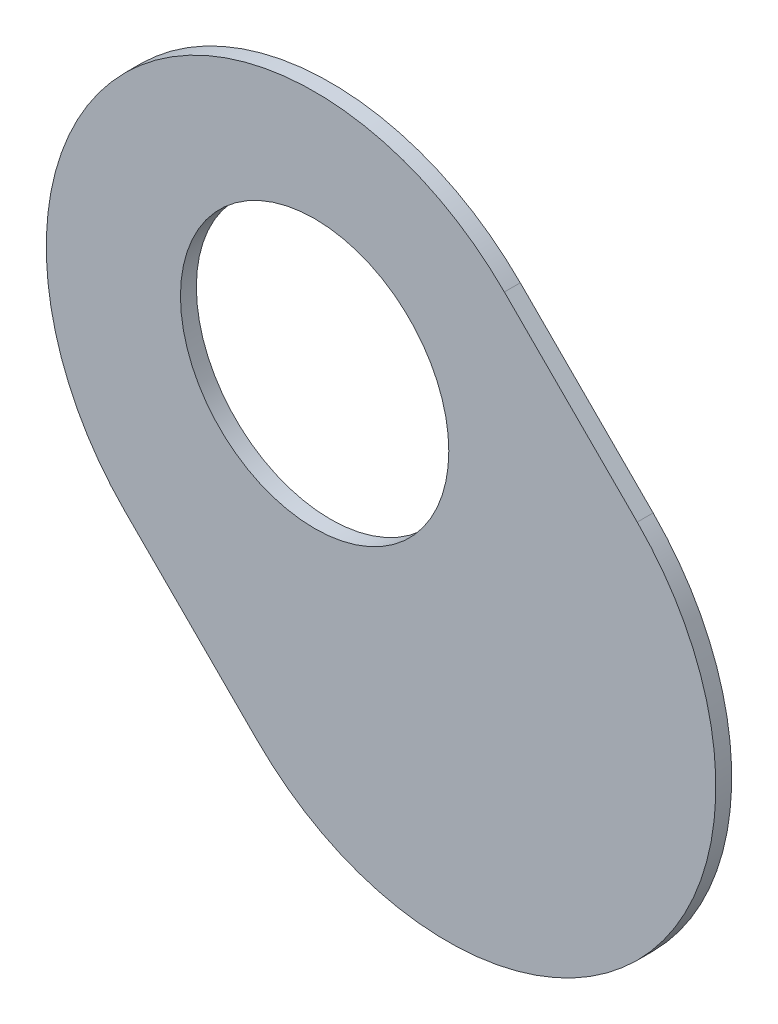
ISO-10303-21;
HEADER;
FILE_DESCRIPTION(('STEP AP214'),'2;1');
FILE_NAME('part.step','',(''),(''),'','','');
FILE_SCHEMA(('AUTOMOTIVE_DESIGN { 1 0 10303 214 1 1 1 1 }'));
ENDSEC;
DATA;
#1=APPLICATION_CONTEXT('core data for automotive mechanical design processes');
#2=APPLICATION_PROTOCOL_DEFINITION('international standard','automotive_design',2000,#1);
#3=PRODUCT_CONTEXT('',#1,'mechanical');
#4=PRODUCT('Part','Part','',(#3));
#5=PRODUCT_RELATED_PRODUCT_CATEGORY('part','',(#4));
#6=PRODUCT_DEFINITION_FORMATION('','',#4);
#7=PRODUCT_DEFINITION_CONTEXT('part definition',#1,'design');
#8=PRODUCT_DEFINITION('design','',#6,#7);
#9=PRODUCT_DEFINITION_SHAPE('','',#8);
#10=(LENGTH_UNIT() NAMED_UNIT(*) SI_UNIT(.MILLI.,.METRE.));
#11=(NAMED_UNIT(*) PLANE_ANGLE_UNIT() SI_UNIT($,.RADIAN.));
#12=(NAMED_UNIT(*) SI_UNIT($,.STERADIAN.) SOLID_ANGLE_UNIT());
#13=UNCERTAINTY_MEASURE_WITH_UNIT(LENGTH_MEASURE(1.E-05),#10,'distance_accuracy_value','');
#14=(GEOMETRIC_REPRESENTATION_CONTEXT(3) GLOBAL_UNCERTAINTY_ASSIGNED_CONTEXT((#13)) GLOBAL_UNIT_ASSIGNED_CONTEXT((#10,
#11,#12)) REPRESENTATION_CONTEXT('',''));
#15=CARTESIAN_POINT('',(0.,0.,0.));
#16=DIRECTION('',(0.,0.,1.));
#17=DIRECTION('',(1.,0.,0.));
#18=AXIS2_PLACEMENT_3D('',#15,#16,#17);
#19=CARTESIAN_POINT('',(82.97572178,95.5216276,0.));
#20=DIRECTION('',(0.707106781186565,0.707106781186531,0.));
#21=DIRECTION('',(0.707106781186531,-0.707106781186565,0.));
#22=AXIS2_PLACEMENT_3D('',#19,#20,#21);
#23=PLANE('',#22);
#24=DIRECTION('',(0.707106781186531,-0.707106781186565,0.));
#25=VECTOR('',#24,1.);
#26=CARTESIAN_POINT('',(82.97572178,95.5216276,0.03556));
#27=LINE('',#26,#25);
#28=CARTESIAN_POINT('',(82.97572178,95.5216276,0.03556));
#29=VERTEX_POINT('',#28);
#30=CARTESIAN_POINT('',(83.27276462,95.22458476,0.03556));
#31=VERTEX_POINT('',#30);
#32=EDGE_CURVE('E11',#29,#31,#27,.T.);
#33=ORIENTED_EDGE('',*,*,#32,.F.);
#34=DIRECTION('',(0.,0.,1.));
#35=VECTOR('',#34,1.);
#36=CARTESIAN_POINT('',(82.97572178,95.5216276,0.));
#37=LINE('',#36,#35);
#38=CARTESIAN_POINT('',(82.97572178,95.5216276,0.));
#39=VERTEX_POINT('',#38);
#40=EDGE_CURVE('E24',#39,#29,#37,.T.);
#41=ORIENTED_EDGE('',*,*,#40,.F.);
#42=DIRECTION('',(0.707106781186531,-0.707106781186565,0.));
#43=VECTOR('',#42,1.);
#44=CARTESIAN_POINT('',(82.97572178,95.5216276,0.));
#45=LINE('',#44,#43);
#46=CARTESIAN_POINT('',(83.27276462,95.22458476,0.));
#47=VERTEX_POINT('',#46);
#48=EDGE_CURVE('E96',#39,#47,#45,.T.);
#49=ORIENTED_EDGE('',*,*,#48,.T.);
#50=DIRECTION('',(0.,0.,1.));
#51=VECTOR('',#50,1.);
#52=CARTESIAN_POINT('',(83.27276462,95.22458476,0.));
#53=LINE('',#52,#51);
#54=EDGE_CURVE('E37',#47,#31,#53,.T.);
#55=ORIENTED_EDGE('',*,*,#54,.T.);
#56=EDGE_LOOP('',(#33,#41,#49,#55));
#57=FACE_BOUND('',#56,.T.);
#58=ADVANCED_FACE('F17',(#57),#23,.F.);
#59=CARTESIAN_POINT('',(83.3999856,95.94589142,0.));
#60=DIRECTION('',(0.,0.,-1.));
#61=DIRECTION('',(0.707106781186548,0.707106781186548,0.));
#62=AXIS2_PLACEMENT_3D('',#59,#60,#61);
#63=CYLINDRICAL_SURFACE('',#62,0.599999648268215);
#64=CARTESIAN_POINT('',(83.3999856,95.94589142,0.03556));
#65=DIRECTION('',(0.,0.,1.));
#66=DIRECTION('',(0.707106781186548,0.707106781186548,0.));
#67=AXIS2_PLACEMENT_3D('',#64,#65,#66);
#68=CIRCLE('',#67,0.599999648268215);
#69=CARTESIAN_POINT('',(83.82424942,96.37015524,0.03556));
#70=VERTEX_POINT('',#69);
#71=EDGE_CURVE('E92',#70,#29,#68,.T.);
#72=ORIENTED_EDGE('',*,*,#71,.F.);
#73=DIRECTION('',(0.,0.,1.));
#74=VECTOR('',#73,1.);
#75=CARTESIAN_POINT('',(83.82424942,96.37015524,0.));
#76=LINE('',#75,#74);
#77=CARTESIAN_POINT('',(83.82424942,96.37015524,0.));
#78=VERTEX_POINT('',#77);
#79=EDGE_CURVE('E90',#78,#70,#76,.T.);
#80=ORIENTED_EDGE('',*,*,#79,.F.);
#81=CARTESIAN_POINT('',(83.3999856,95.94589142,0.));
#82=DIRECTION('',(0.,0.,1.));
#83=DIRECTION('',(0.707106781186548,0.707106781186548,0.));
#84=AXIS2_PLACEMENT_3D('',#81,#82,#83);
#85=CIRCLE('',#84,0.599999648268215);
#86=EDGE_CURVE('E88',#78,#39,#85,.T.);
#87=ORIENTED_EDGE('',*,*,#86,.T.);
#88=ORIENTED_EDGE('',*,*,#40,.T.);
#89=EDGE_LOOP('',(#72,#80,#87,#88));
#90=FACE_BOUND('',#89,.T.);
#91=ADVANCED_FACE('F111',(#90),#63,.T.);
#92=CARTESIAN_POINT('',(83.69702844,95.64884858,0.));
#93=DIRECTION('',(0.,0.,-1.));
#94=DIRECTION('',(-0.707106781186559,-0.707106781186536,0.));
#95=AXIS2_PLACEMENT_3D('',#92,#93,#94);
#96=CYLINDRICAL_SURFACE('',#95,0.599999648268215);
#97=CARTESIAN_POINT('',(83.69702844,95.64884858,0.03556));
#98=DIRECTION('',(0.,0.,1.));
#99=DIRECTION('',(-0.707106781186559,-0.707106781186536,0.));
#100=AXIS2_PLACEMENT_3D('',#97,#98,#99);
#101=CIRCLE('',#100,0.599999648268215);
#102=CARTESIAN_POINT('',(84.12129226,96.0731124,0.03556));
#103=VERTEX_POINT('',#102);
#104=EDGE_CURVE('E85',#31,#103,#101,.T.);
#105=ORIENTED_EDGE('',*,*,#104,.F.);
#106=ORIENTED_EDGE('',*,*,#54,.F.);
#107=CARTESIAN_POINT('',(83.69702844,95.64884858,0.));
#108=DIRECTION('',(0.,0.,1.));
#109=DIRECTION('',(-0.707106781186559,-0.707106781186536,0.));
#110=AXIS2_PLACEMENT_3D('',#107,#108,#109);
#111=CIRCLE('',#110,0.599999648268215);
#112=CARTESIAN_POINT('',(84.12129226,96.0731124,0.));
#113=VERTEX_POINT('',#112);
#114=EDGE_CURVE('E82',#47,#113,#111,.T.);
#115=ORIENTED_EDGE('',*,*,#114,.T.);
#116=DIRECTION('',(0.,0.,1.));
#117=VECTOR('',#116,1.);
#118=CARTESIAN_POINT('',(84.12129226,96.0731124,0.));
#119=LINE('',#118,#117);
#120=EDGE_CURVE('E80',#113,#103,#119,.T.);
#121=ORIENTED_EDGE('',*,*,#120,.T.);
#122=EDGE_LOOP('',(#105,#106,#115,#121));
#123=FACE_BOUND('',#122,.T.);
#124=ADVANCED_FACE('F104',(#123),#96,.T.);
#125=CARTESIAN_POINT('',(84.12129226,96.0731124,0.));
#126=DIRECTION('',(-0.707106781186548,-0.707106781186548,0.));
#127=DIRECTION('',(-0.707106781186548,0.707106781186548,0.));
#128=AXIS2_PLACEMENT_3D('',#125,#126,#127);
#129=PLANE('',#128);
#130=DIRECTION('',(-0.707106781186548,0.707106781186548,0.));
#131=VECTOR('',#130,1.);
#132=CARTESIAN_POINT('',(84.12129226,96.0731124,0.03556));
#133=LINE('',#132,#131);
#134=EDGE_CURVE('E77',#103,#70,#133,.T.);
#135=ORIENTED_EDGE('',*,*,#134,.F.);
#136=ORIENTED_EDGE('',*,*,#120,.F.);
#137=DIRECTION('',(-0.707106781186548,0.707106781186548,0.));
#138=VECTOR('',#137,1.);
#139=CARTESIAN_POINT('',(84.12129226,96.0731124,0.));
#140=LINE('',#139,#138);
#141=EDGE_CURVE('E68',#113,#78,#140,.T.);
#142=ORIENTED_EDGE('',*,*,#141,.T.);
#143=ORIENTED_EDGE('',*,*,#79,.T.);
#144=EDGE_LOOP('',(#135,#136,#142,#143));
#145=FACE_BOUND('',#144,.T.);
#146=ADVANCED_FACE('F110',(#145),#129,.F.);
#147=CARTESIAN_POINT('',(83.3999856,96.0000112,0.));
#148=DIRECTION('',(0.,0.,-1.));
#149=DIRECTION('',(1.,0.,0.));
#150=AXIS2_PLACEMENT_3D('',#147,#148,#149);
#151=CYLINDRICAL_SURFACE('',#150,0.2999994);
#152=DIRECTION('',(0.,0.,1.));
#153=VECTOR('',#152,1.);
#154=CARTESIAN_POINT('',(83.699985,96.0000112,0.));
#155=LINE('',#154,#153);
#156=CARTESIAN_POINT('',(83.699985,96.0000112,0.));
#157=VERTEX_POINT('',#156);
#158=CARTESIAN_POINT('',(83.699985,96.0000112,0.03556));
#159=VERTEX_POINT('',#158);
#160=EDGE_CURVE('E62',#157,#159,#155,.T.);
#161=ORIENTED_EDGE('',*,*,#160,.T.);
#162=CARTESIAN_POINT('',(83.3999856,96.0000112,0.03556));
#163=DIRECTION('',(0.,0.,1.));
#164=DIRECTION('',(1.,0.,0.));
#165=AXIS2_PLACEMENT_3D('',#162,#163,#164);
#166=CIRCLE('',#165,0.2999994);
#167=EDGE_CURVE('E67',#159,#159,#166,.T.);
#168=ORIENTED_EDGE('',*,*,#167,.T.);
#169=ORIENTED_EDGE('',*,*,#160,.F.);
#170=CARTESIAN_POINT('',(83.3999856,96.0000112,0.));
#171=DIRECTION('',(0.,0.,1.));
#172=DIRECTION('',(1.,0.,0.));
#173=AXIS2_PLACEMENT_3D('',#170,#171,#172);
#174=CIRCLE('',#173,0.2999994);
#175=EDGE_CURVE('E65',#157,#157,#174,.T.);
#176=ORIENTED_EDGE('',*,*,#175,.F.);
#177=EDGE_LOOP('',(#161,#168,#169,#176));
#178=FACE_BOUND('',#177,.T.);
#179=ADVANCED_FACE('F64',(#178),#151,.F.);
#180=CARTESIAN_POINT('',(82.97572178,95.5216276,0.));
#181=DIRECTION('',(0.,0.,-1.));
#182=DIRECTION('',(-1.,0.,0.));
#183=AXIS2_PLACEMENT_3D('',#180,#181,#182);
#184=PLANE('',#183);
#185=ORIENTED_EDGE('',*,*,#48,.F.);
#186=ORIENTED_EDGE('',*,*,#86,.F.);
#187=ORIENTED_EDGE('',*,*,#141,.F.);
#188=ORIENTED_EDGE('',*,*,#114,.F.);
#189=EDGE_LOOP('',(#185,#186,#187,#188));
#190=FACE_BOUND('',#189,.T.);
#191=ORIENTED_EDGE('',*,*,#175,.T.);
#192=EDGE_LOOP('',(#191));
#193=FACE_BOUND('',#192,.T.);
#194=ADVANCED_FACE('F71',(#190,#193),#184,.T.);
#195=CARTESIAN_POINT('',(82.97572178,95.5216276,0.03556));
#196=DIRECTION('',(0.,0.,-1.));
#197=DIRECTION('',(-1.,0.,0.));
#198=AXIS2_PLACEMENT_3D('',#195,#196,#197);
#199=PLANE('',#198);
#200=ORIENTED_EDGE('',*,*,#134,.T.);
#201=ORIENTED_EDGE('',*,*,#71,.T.);
#202=ORIENTED_EDGE('',*,*,#32,.T.);
#203=ORIENTED_EDGE('',*,*,#104,.T.);
#204=EDGE_LOOP('',(#200,#201,#202,#203));
#205=FACE_BOUND('',#204,.T.);
#206=ORIENTED_EDGE('',*,*,#167,.F.);
#207=EDGE_LOOP('',(#206));
#208=FACE_BOUND('',#207,.T.);
#209=ADVANCED_FACE('F107',(#205,#208),#199,.F.);
#210=CLOSED_SHELL('',(#58,#91,#124,#146,#179,#194,#209));
#211=MANIFOLD_SOLID_BREP('B1',#210);
#212=ADVANCED_BREP_SHAPE_REPRESENTATION('',(#18,#211),#14);
#213=SHAPE_DEFINITION_REPRESENTATION(#9,#212);
ENDSEC;
END-ISO-10303-21;
